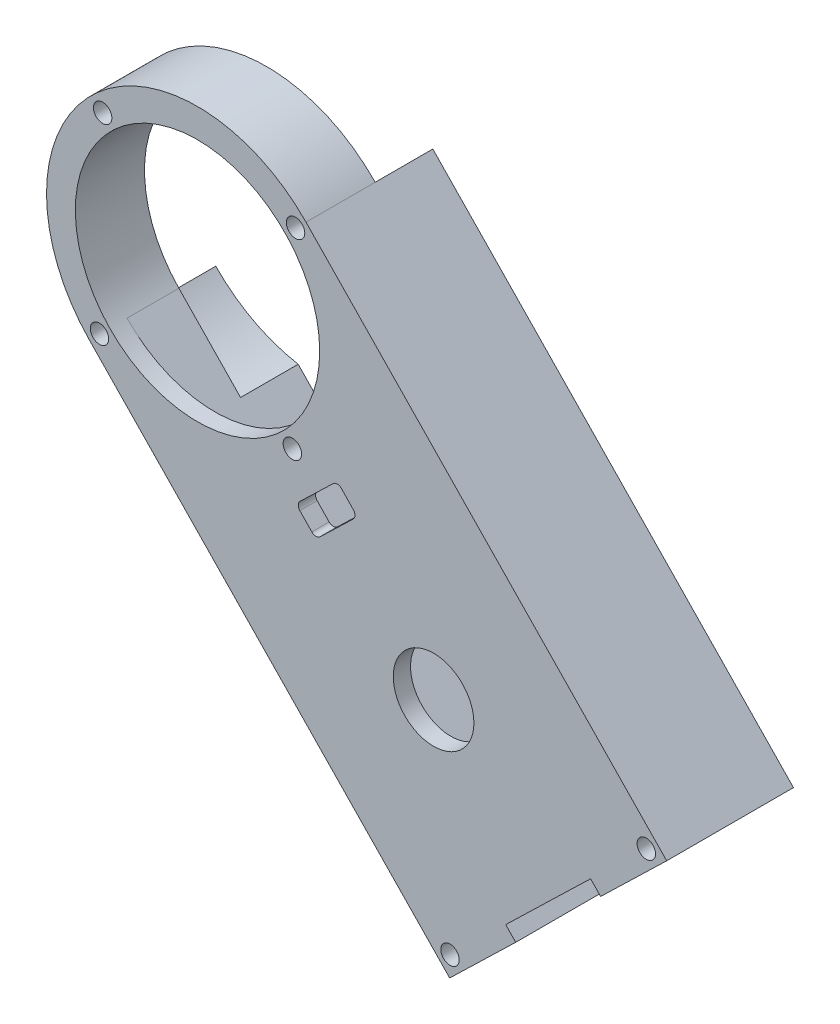
ISO-10303-21;
HEADER;
FILE_DESCRIPTION(('STEP AP214'),'2;1');
FILE_NAME('part.step','',(''),(''),'','','');
FILE_SCHEMA(('AUTOMOTIVE_DESIGN { 1 0 10303 214 1 1 1 1 }'));
ENDSEC;
DATA;
#1=APPLICATION_CONTEXT('core data for automotive mechanical design processes');
#2=APPLICATION_PROTOCOL_DEFINITION('international standard','automotive_design',2000,#1);
#3=PRODUCT_CONTEXT('',#1,'mechanical');
#4=PRODUCT('Part','Part','',(#3));
#5=PRODUCT_RELATED_PRODUCT_CATEGORY('part','',(#4));
#6=PRODUCT_DEFINITION_FORMATION('','',#4);
#7=PRODUCT_DEFINITION_CONTEXT('part definition',#1,'design');
#8=PRODUCT_DEFINITION('design','',#6,#7);
#9=PRODUCT_DEFINITION_SHAPE('','',#8);
#10=(LENGTH_UNIT() NAMED_UNIT(*) SI_UNIT(.MILLI.,.METRE.));
#11=(NAMED_UNIT(*) PLANE_ANGLE_UNIT() SI_UNIT($,.RADIAN.));
#12=(NAMED_UNIT(*) SI_UNIT($,.STERADIAN.) SOLID_ANGLE_UNIT());
#13=UNCERTAINTY_MEASURE_WITH_UNIT(LENGTH_MEASURE(1.E-05),#10,'distance_accuracy_value','');
#14=(GEOMETRIC_REPRESENTATION_CONTEXT(3) GLOBAL_UNCERTAINTY_ASSIGNED_CONTEXT((#13)) GLOBAL_UNIT_ASSIGNED_CONTEXT((#10,
#11,#12)) REPRESENTATION_CONTEXT('',''));
#15=CARTESIAN_POINT('',(0.,0.,0.));
#16=DIRECTION('',(0.,0.,1.));
#17=DIRECTION('',(1.,0.,0.));
#18=AXIS2_PLACEMENT_3D('',#15,#16,#17);
#19=CARTESIAN_POINT('',(43.8707482583933,-75.8274188354628,22.));
#20=DIRECTION('',(0.718654486573144,0.695367333808751,0.));
#21=DIRECTION('',(-0.695367333808751,0.718654486573144,0.));
#22=AXIS2_PLACEMENT_3D('',#19,#20,#21);
#23=PLANE('',#22);
#24=DIRECTION('',(0.,0.,-1.));
#25=VECTOR('',#24,1.);
#26=CARTESIAN_POINT('',(-15.2354751153505,-14.7417874767456,22.));
#27=LINE('',#26,#25);
#28=CARTESIAN_POINT('',(-15.2354751153505,-14.7417874767456,19.));
#29=VERTEX_POINT('',#28);
#30=CARTESIAN_POINT('',(-15.2354751153505,-14.7417874767456,10.));
#31=VERTEX_POINT('',#30);
#32=EDGE_CURVE('E53',#29,#31,#27,.T.);
#33=ORIENTED_EDGE('',*,*,#32,.F.);
#34=DIRECTION('',(0.695367333808751,-0.718654486573144,0.));
#35=VECTOR('',#34,1.);
#36=CARTESIAN_POINT('',(-15.2354751153505,-14.7417874767456,19.));
#37=LINE('',#36,#35);
#38=CARTESIAN_POINT('',(43.8707482583933,-75.8274188354628,19.));
#39=VERTEX_POINT('',#38);
#40=EDGE_CURVE('E57',#29,#39,#37,.T.);
#41=ORIENTED_EDGE('',*,*,#40,.T.);
#42=DIRECTION('',(0.,0.,-1.));
#43=VECTOR('',#42,1.);
#44=CARTESIAN_POINT('',(43.8707482583933,-75.8274188354628,22.));
#45=LINE('',#44,#43);
#46=CARTESIAN_POINT('',(43.8707482583933,-75.8274188354628,0.));
#47=VERTEX_POINT('',#46);
#48=EDGE_CURVE('E317',#39,#47,#45,.T.);
#49=ORIENTED_EDGE('',*,*,#48,.T.);
#50=DIRECTION('',(0.695367333808751,-0.718654486573144,0.));
#51=VECTOR('',#50,1.);
#52=CARTESIAN_POINT('',(43.8707482583933,-75.8274188354628,0.));
#53=LINE('',#52,#51);
#54=CARTESIAN_POINT('',(-4.53043108199875,-25.8053326700365,0.));
#55=VERTEX_POINT('',#54);
#56=EDGE_CURVE('E303',#55,#47,#53,.T.);
#57=ORIENTED_EDGE('',*,*,#56,.F.);
#58=DIRECTION('',(0.,0.,-1.));
#59=VECTOR('',#58,1.);
#60=CARTESIAN_POINT('',(-4.53043108199875,-25.8053326700365,10.));
#61=LINE('',#60,#59);
#62=CARTESIAN_POINT('',(-4.53043108199875,-25.8053326700365,10.));
#63=VERTEX_POINT('',#62);
#64=EDGE_CURVE('E296',#63,#55,#61,.T.);
#65=ORIENTED_EDGE('',*,*,#64,.F.);
#66=DIRECTION('',(-0.695367333808751,0.718654486573144,0.));
#67=VECTOR('',#66,1.);
#68=CARTESIAN_POINT('',(43.8707482583933,-75.8274188354628,10.));
#69=LINE('',#68,#67);
#70=EDGE_CURVE('E294',#63,#31,#69,.T.);
#71=ORIENTED_EDGE('',*,*,#70,.T.);
#72=EDGE_LOOP('',(#33,#41,#49,#57,#65,#71));
#73=FACE_BOUND('',#72,.T.);
#74=ADVANCED_FACE('F36',(#73),#23,.T.);
#75=CARTESIAN_POINT('',(74.3416984890946,-46.3438438819718,22.));
#76=DIRECTION('',(-0.695367333808751,0.718654486573144,0.));
#77=DIRECTION('',(-0.718654486573144,-0.695367333808751,0.));
#78=AXIS2_PLACEMENT_3D('',#75,#76,#77);
#79=PLANE('',#78);
#80=CARTESIAN_POINT('',(70.2453679156274,-50.3074376846819,11.5000000000073));
#81=DIRECTION('',(0.695367333808751,-0.718654486573144,0.));
#82=DIRECTION('',(0.718654486573144,0.695367333808751,0.));
#83=AXIS2_PLACEMENT_3D('',#80,#81,#82);
#84=CIRCLE('',#83,1.8);
#85=CARTESIAN_POINT('',(71.538945991459,-49.0557764838262,11.5000000000073));
#86=VERTEX_POINT('',#85);
#87=EDGE_CURVE('E241',#86,#86,#84,.T.);
#88=ORIENTED_EDGE('',*,*,#87,.T.);
#89=EDGE_LOOP('',(#88));
#90=FACE_BOUND('',#89,.T.);
#91=CARTESIAN_POINT('',(47.9670788318599,-71.8638250327532,11.5000000000027));
#92=DIRECTION('',(0.695367333808751,-0.718654486573144,0.));
#93=DIRECTION('',(0.718654486573144,0.695367333808751,0.));
#94=AXIS2_PLACEMENT_3D('',#91,#92,#93);
#95=CIRCLE('',#94,1.8);
#96=CARTESIAN_POINT('',(49.2606569076916,-70.6121638318975,11.5000000000027));
#97=VERTEX_POINT('',#96);
#98=EDGE_CURVE('E409',#97,#97,#95,.T.);
#99=ORIENTED_EDGE('',*,*,#98,.T.);
#100=EDGE_LOOP('',(#99));
#101=FACE_BOUND('',#100,.T.);
#102=ORIENTED_EDGE('',*,*,#48,.F.);
#103=DIRECTION('',(0.718654486573144,0.695367333808751,0.));
#104=VECTOR('',#103,1.);
#105=CARTESIAN_POINT('',(43.8707482583933,-75.8274188354628,19.));
#106=LINE('',#105,#104);
#107=CARTESIAN_POINT('',(74.3416984890946,-46.3438438819718,19.));
#108=VERTEX_POINT('',#107);
#109=EDGE_CURVE('E277',#39,#108,#106,.T.);
#110=ORIENTED_EDGE('',*,*,#109,.T.);
#111=DIRECTION('',(0.,0.,-1.));
#112=VECTOR('',#111,1.);
#113=CARTESIAN_POINT('',(74.3416984890946,-46.3438438819718,22.));
#114=LINE('',#113,#112);
#115=CARTESIAN_POINT('',(74.3416984890946,-46.3438438819718,0.));
#116=VERTEX_POINT('',#115);
#117=EDGE_CURVE('E307',#108,#116,#114,.T.);
#118=ORIENTED_EDGE('',*,*,#117,.T.);
#119=DIRECTION('',(0.718654486573144,0.695367333808751,0.));
#120=VECTOR('',#119,1.);
#121=CARTESIAN_POINT('',(74.3416984890946,-46.3438438819718,0.));
#122=LINE('',#121,#120);
#123=EDGE_CURVE('E311',#47,#116,#122,.T.);
#124=ORIENTED_EDGE('',*,*,#123,.F.);
#125=EDGE_LOOP('',(#102,#110,#118,#124));
#126=FACE_BOUND('',#125,.T.);
#127=ADVANCED_FACE('F473',(#90,#101,#126),#79,.T.);
#128=CARTESIAN_POINT('',(37.4687342562338,-8.23604115552882,22.));
#129=DIRECTION('',(-0.718654486573144,-0.695367333808751,0.));
#130=DIRECTION('',(0.695367333808751,-0.718654486573144,0.));
#131=AXIS2_PLACEMENT_3D('',#128,#129,#130);
#132=PLANE('',#131);
#133=ORIENTED_EDGE('',*,*,#117,.F.);
#134=DIRECTION('',(-0.695367333808751,0.718654486573144,0.));
#135=VECTOR('',#134,1.);
#136=CARTESIAN_POINT('',(74.3416984890946,-46.3438438819718,19.));
#137=LINE('',#136,#135);
#138=CARTESIAN_POINT('',(15.2354751153508,14.7417874767454,19.));
#139=VERTEX_POINT('',#138);
#140=EDGE_CURVE('E279',#108,#139,#137,.T.);
#141=ORIENTED_EDGE('',*,*,#140,.T.);
#142=DIRECTION('',(0.,0.,-1.));
#143=VECTOR('',#142,1.);
#144=CARTESIAN_POINT('',(15.2354751153508,14.7417874767454,22.));
#145=LINE('',#144,#143);
#146=CARTESIAN_POINT('',(15.2354751153508,14.7417874767454,10.));
#147=VERTEX_POINT('',#146);
#148=EDGE_CURVE('E320',#139,#147,#145,.T.);
#149=ORIENTED_EDGE('',*,*,#148,.T.);
#150=DIRECTION('',(0.695367333808751,-0.718654486573144,0.));
#151=VECTOR('',#150,1.);
#152=CARTESIAN_POINT('',(37.4687342562338,-8.23604115552882,10.));
#153=LINE('',#152,#151);
#154=CARTESIAN_POINT('',(25.9405191487024,3.67824228345468,10.));
#155=VERTEX_POINT('',#154);
#156=EDGE_CURVE('E45',#147,#155,#153,.T.);
#157=ORIENTED_EDGE('',*,*,#156,.T.);
#158=DIRECTION('',(0.,0.,-1.));
#159=VECTOR('',#158,1.);
#160=CARTESIAN_POINT('',(25.9405191487024,3.67824228345469,10.));
#161=LINE('',#160,#159);
#162=CARTESIAN_POINT('',(25.9405191487024,3.67824228345468,0.));
#163=VERTEX_POINT('',#162);
#164=EDGE_CURVE('E11',#163,#155,#161,.F.);
#165=ORIENTED_EDGE('',*,*,#164,.F.);
#166=DIRECTION('',(-0.695367333808751,0.718654486573144,0.));
#167=VECTOR('',#166,1.);
#168=CARTESIAN_POINT('',(37.4687342562338,-8.23604115552882,0.));
#169=LINE('',#168,#167);
#170=EDGE_CURVE('E308',#116,#163,#169,.T.);
#171=ORIENTED_EDGE('',*,*,#170,.F.);
#172=EDGE_LOOP('',(#133,#141,#149,#157,#165,#171));
#173=FACE_BOUND('',#172,.T.);
#174=ADVANCED_FACE('F478',(#173),#132,.T.);
#175=CARTESIAN_POINT('',(1.56957780106382E-13,-1.13520304267922E-13,22.));
#176=DIRECTION('',(0.,0.,-1.));
#177=DIRECTION('',(-1.,0.,0.));
#178=AXIS2_PLACEMENT_3D('',#175,#176,#177);
#179=CYLINDRICAL_SURFACE('',#178,26.2);
#180=CARTESIAN_POINT('',(0.,0.,10.));
#181=DIRECTION('',(0.,0.,-1.));
#182=DIRECTION('',(-1.,0.,0.));
#183=AXIS2_PLACEMENT_3D('',#180,#181,#182);
#184=CIRCLE('',#183,26.1999999999998);
#185=CARTESIAN_POINT('',(-18.8287475482163,-18.2186241457892,10.));
#186=VERTEX_POINT('',#185);
#187=CARTESIAN_POINT('',(18.8287475482164,18.218624145789,10.));
#188=VERTEX_POINT('',#187);
#189=EDGE_CURVE('E289',#186,#188,#184,.T.);
#190=ORIENTED_EDGE('',*,*,#189,.F.);
#191=DIRECTION('',(0.,0.,-1.));
#192=VECTOR('',#191,1.);
#193=CARTESIAN_POINT('',(-18.8287475482163,-18.2186241457893,22.));
#194=LINE('',#193,#192);
#195=CARTESIAN_POINT('',(-18.8287475482163,-18.2186241457893,22.));
#196=VERTEX_POINT('',#195);
#197=EDGE_CURVE('E370',#196,#186,#194,.T.);
#198=ORIENTED_EDGE('',*,*,#197,.F.);
#199=CARTESIAN_POINT('',(1.56957780106382E-13,-1.13520304267922E-13,22.));
#200=DIRECTION('',(0.,0.,1.));
#201=DIRECTION('',(1.,0.,0.));
#202=AXIS2_PLACEMENT_3D('',#199,#200,#201);
#203=CIRCLE('',#202,26.2);
#204=CARTESIAN_POINT('',(18.8287475482165,18.2186241457892,22.));
#205=VERTEX_POINT('',#204);
#206=EDGE_CURVE('E329',#205,#196,#203,.T.);
#207=ORIENTED_EDGE('',*,*,#206,.F.);
#208=DIRECTION('',(0.,0.,-1.));
#209=VECTOR('',#208,1.);
#210=CARTESIAN_POINT('',(18.8287475482165,18.2186241457892,22.));
#211=LINE('',#210,#209);
#212=EDGE_CURVE('E373',#205,#188,#211,.T.);
#213=ORIENTED_EDGE('',*,*,#212,.T.);
#214=EDGE_LOOP('',(#190,#198,#207,#213));
#215=FACE_BOUND('',#214,.T.);
#216=ADVANCED_FACE('F484',(#215),#179,.T.);
#217=CARTESIAN_POINT('',(1.56957780106382E-13,-1.13520304267922E-13,22.));
#218=DIRECTION('',(0.,0.,-1.));
#219=DIRECTION('',(-1.,0.,0.));
#220=AXIS2_PLACEMENT_3D('',#217,#218,#219);
#221=CYLINDRICAL_SURFACE('',#220,21.2);
#222=CARTESIAN_POINT('',(0.,0.,19.));
#223=DIRECTION('',(0.,0.,-1.));
#224=DIRECTION('',(1.,0.,0.));
#225=AXIS2_PLACEMENT_3D('',#222,#223,#224);
#226=CIRCLE('',#225,21.2);
#227=EDGE_CURVE('E281',#139,#29,#226,.T.);
#228=ORIENTED_EDGE('',*,*,#227,.T.);
#229=ORIENTED_EDGE('',*,*,#32,.T.);
#230=CARTESIAN_POINT('',(1.56957780106382E-13,-1.13520304267922E-13,10.));
#231=DIRECTION('',(0.,0.,-1.));
#232=DIRECTION('',(-1.,0.,0.));
#233=AXIS2_PLACEMENT_3D('',#230,#231,#232);
#234=CIRCLE('',#233,21.2);
#235=EDGE_CURVE('E287',#31,#147,#234,.T.);
#236=ORIENTED_EDGE('',*,*,#235,.T.);
#237=ORIENTED_EDGE('',*,*,#148,.F.);
#238=EDGE_LOOP('',(#228,#229,#236,#237));
#239=FACE_BOUND('',#238,.T.);
#240=CARTESIAN_POINT('',(1.56957780106382E-13,-1.13520304267922E-13,22.));
#241=DIRECTION('',(0.,0.,1.));
#242=DIRECTION('',(1.,0.,0.));
#243=AXIS2_PLACEMENT_3D('',#240,#241,#242);
#244=CIRCLE('',#243,21.2);
#245=CARTESIAN_POINT('',(21.2000000000001,-1.13520304267922E-13,22.));
#246=VERTEX_POINT('',#245);
#247=EDGE_CURVE('E304',#246,#246,#244,.T.);
#248=ORIENTED_EDGE('',*,*,#247,.T.);
#249=EDGE_LOOP('',(#248));
#250=FACE_BOUND('',#249,.T.);
#251=ADVANCED_FACE('F441',(#239,#250),#221,.F.);
#252=CARTESIAN_POINT('',(1.56957780106382E-13,-1.13520304267922E-13,22.));
#253=DIRECTION('',(0.,0.,1.));
#254=DIRECTION('',(1.,0.,0.));
#255=AXIS2_PLACEMENT_3D('',#252,#253,#254);
#256=PLANE('',#255);
#257=CARTESIAN_POINT('',(-17.0123602989575,-16.4610947874136,22.));
#258=DIRECTION('',(0.,0.,1.));
#259=DIRECTION('',(1.,0.,0.));
#260=AXIS2_PLACEMENT_3D('',#257,#258,#259);
#261=CIRCLE('',#260,1.60000000000052);
#262=CARTESIAN_POINT('',(-15.412360298957,-16.4610947874136,22.));
#263=VERTEX_POINT('',#262);
#264=EDGE_CURVE('E426',#263,#263,#261,.T.);
#265=ORIENTED_EDGE('',*,*,#264,.F.);
#266=EDGE_LOOP('',(#265));
#267=FACE_BOUND('',#266,.T.);
#268=CARTESIAN_POINT('',(16.4610947874145,-17.0123602989575,22.));
#269=DIRECTION('',(0.,0.,1.));
#270=DIRECTION('',(1.,0.,0.));
#271=AXIS2_PLACEMENT_3D('',#268,#269,#270);
#272=CIRCLE('',#271,1.60000000000135);
#273=CARTESIAN_POINT('',(18.0610947874159,-17.0123602989575,22.));
#274=VERTEX_POINT('',#273);
#275=EDGE_CURVE('E429',#274,#274,#272,.T.);
#276=ORIENTED_EDGE('',*,*,#275,.F.);
#277=EDGE_LOOP('',(#276));
#278=FACE_BOUND('',#277,.T.);
#279=CARTESIAN_POINT('',(17.0123602989585,16.4610947874145,22.));
#280=DIRECTION('',(0.,0.,1.));
#281=DIRECTION('',(1.,0.,0.));
#282=AXIS2_PLACEMENT_3D('',#279,#280,#281);
#283=CIRCLE('',#282,1.60000000000098);
#284=CARTESIAN_POINT('',(18.6123602989595,16.4610947874145,22.));
#285=VERTEX_POINT('',#284);
#286=EDGE_CURVE('E425',#285,#285,#283,.T.);
#287=ORIENTED_EDGE('',*,*,#286,.F.);
#288=EDGE_LOOP('',(#287));
#289=FACE_BOUND('',#288,.T.);
#290=CARTESIAN_POINT('',(-16.4610947874136,17.0123602989585,22.));
#291=DIRECTION('',(0.,0.,1.));
#292=DIRECTION('',(1.,0.,0.));
#293=AXIS2_PLACEMENT_3D('',#290,#291,#292);
#294=CIRCLE('',#293,1.6);
#295=CARTESIAN_POINT('',(-14.8610947874136,17.0123602989585,22.));
#296=VERTEX_POINT('',#295);
#297=EDGE_CURVE('E385',#296,#296,#294,.T.);
#298=ORIENTED_EDGE('',*,*,#297,.F.);
#299=EDGE_LOOP('',(#298));
#300=FACE_BOUND('',#299,.T.);
#301=CARTESIAN_POINT('',(77.8767530400493,-46.4020617638827,22.));
#302=DIRECTION('',(0.,0.,1.));
#303=DIRECTION('',(1.,0.,0.));
#304=AXIS2_PLACEMENT_3D('',#301,#302,#303);
#305=CIRCLE('',#304,1.60000000000001);
#306=CARTESIAN_POINT('',(79.4767530400493,-46.4020617638827,22.));
#307=VERTEX_POINT('',#306);
#308=EDGE_CURVE('E401',#307,#307,#305,.T.);
#309=ORIENTED_EDGE('',*,*,#308,.F.);
#310=EDGE_LOOP('',(#309));
#311=FACE_BOUND('',#310,.T.);
#312=CARTESIAN_POINT('',(43.8125303764823,-79.3624733864175,22.));
#313=DIRECTION('',(0.,0.,1.));
#314=DIRECTION('',(1.,0.,0.));
#315=AXIS2_PLACEMENT_3D('',#312,#313,#314);
#316=CIRCLE('',#315,1.6);
#317=CARTESIAN_POINT('',(45.4125303764823,-79.3624733864175,22.));
#318=VERTEX_POINT('',#317);
#319=EDGE_CURVE('E392',#318,#318,#316,.T.);
#320=ORIENTED_EDGE('',*,*,#319,.F.);
#321=EDGE_LOOP('',(#320));
#322=FACE_BOUND('',#321,.T.);
#323=DIRECTION('',(0.718654486573144,0.695367333808751,0.));
#324=VECTOR('',#323,1.);
#325=CARTESIAN_POINT('',(69.9492685301624,-57.5513886200433,22.));
#326=LINE('',#325,#324);
#327=CARTESIAN_POINT('',(69.9492685301624,-57.5513886200433,22.));
#328=VERTEX_POINT('',#327);
#329=CARTESIAN_POINT('',(81.411807591004,-46.4602796457937,22.));
#330=VERTEX_POINT('',#329);
#331=EDGE_CURVE('E323',#328,#330,#326,.T.);
#332=ORIENTED_EDGE('',*,*,#331,.T.);
#333=DIRECTION('',(-0.695367333808751,0.718654486573144,0.));
#334=VECTOR('',#333,1.);
#335=CARTESIAN_POINT('',(81.411807591004,-46.4602796457937,22.));
#336=LINE('',#335,#334);
#337=EDGE_CURVE('E326',#330,#205,#336,.T.);
#338=ORIENTED_EDGE('',*,*,#337,.T.);
#339=ORIENTED_EDGE('',*,*,#206,.T.);
#340=DIRECTION('',(0.695367333808751,-0.718654486573144,0.));
#341=VECTOR('',#340,1.);
#342=CARTESIAN_POINT('',(-18.8287475482163,-18.2186241457893,22.));
#343=LINE('',#342,#341);
#344=CARTESIAN_POINT('',(43.7543124945713,-82.8975279373723,22.));
#345=VERTEX_POINT('',#344);
#346=EDGE_CURVE('E331',#196,#345,#343,.T.);
#347=ORIENTED_EDGE('',*,*,#346,.T.);
#348=DIRECTION('',(0.718654486573144,0.695367333808751,0.));
#349=VECTOR('',#348,1.);
#350=CARTESIAN_POINT('',(43.7543124945713,-82.8975279373723,22.));
#351=LINE('',#350,#349);
#352=CARTESIAN_POINT('',(55.2168515554129,-71.8064189631227,22.));
#353=VERTEX_POINT('',#352);
#354=EDGE_CURVE('E333',#345,#353,#351,.T.);
#355=ORIENTED_EDGE('',*,*,#354,.T.);
#356=DIRECTION('',(-0.69536733380875,0.718654486573145,0.));
#357=VECTOR('',#356,1.);
#358=CARTESIAN_POINT('',(55.2168515554129,-71.8064189631227,22.));
#359=LINE('',#358,#357);
#360=CARTESIAN_POINT('',(53.4784332208911,-70.0097827466898,22.));
#361=VERTEX_POINT('',#360);
#362=EDGE_CURVE('E335',#353,#361,#359,.T.);
#363=ORIENTED_EDGE('',*,*,#362,.T.);
#364=DIRECTION('',(0.718654486573144,0.695367333808751,0.));
#365=VECTOR('',#364,1.);
#366=CARTESIAN_POINT('',(53.4784332208911,-70.0097827466898,22.));
#367=LINE('',#366,#365);
#368=CARTESIAN_POINT('',(68.2108501956405,-55.7547524036104,22.));
#369=VERTEX_POINT('',#368);
#370=EDGE_CURVE('E337',#361,#369,#367,.T.);
#371=ORIENTED_EDGE('',*,*,#370,.T.);
#372=DIRECTION('',(0.69536733380875,-0.718654486573145,0.));
#373=VECTOR('',#372,1.);
#374=CARTESIAN_POINT('',(68.2108501956405,-55.7547524036104,22.));
#375=LINE('',#374,#373);
#376=EDGE_CURVE('E339',#369,#328,#375,.T.);
#377=ORIENTED_EDGE('',*,*,#376,.T.);
#378=EDGE_LOOP('',(#332,#338,#339,#347,#355,#363,#371,#377));
#379=FACE_BOUND('',#378,.T.);
#380=ORIENTED_EDGE('',*,*,#247,.F.);
#381=EDGE_LOOP('',(#380));
#382=FACE_BOUND('',#381,.T.);
#383=CARTESIAN_POINT('',(18.4812604364384,-24.9678504211436,22.));
#384=DIRECTION('',(0.,0.,1.));
#385=DIRECTION('',(1.,0.,0.));
#386=AXIS2_PLACEMENT_3D('',#383,#384,#385);
#387=CIRCLE('',#386,1.);
#388=CARTESIAN_POINT('',(17.7877664641137,-24.247387993012,22.));
#389=VERTEX_POINT('',#388);
#390=CARTESIAN_POINT('',(17.7607980083068,-25.6613443934683,22.));
#391=VERTEX_POINT('',#390);
#392=EDGE_CURVE('E198',#389,#391,#387,.T.);
#393=ORIENTED_EDGE('',*,*,#392,.F.);
#394=DIRECTION('',(-0.720462428131584,-0.693493972324736,0.));
#395=VECTOR('',#394,1.);
#396=CARTESIAN_POINT('',(23.5514658891663,-18.6994362144141,22.));
#397=LINE('',#396,#395);
#398=CARTESIAN_POINT('',(23.5514658891663,-18.6994362144141,22.));
#399=VERTEX_POINT('',#398);
#400=EDGE_CURVE('E217',#399,#389,#397,.T.);
#401=ORIENTED_EDGE('',*,*,#400,.F.);
#402=CARTESIAN_POINT('',(24.2449598614911,-19.4198986425457,22.));
#403=DIRECTION('',(0.,0.,1.));
#404=DIRECTION('',(1.,0.,0.));
#405=AXIS2_PLACEMENT_3D('',#402,#403,#404);
#406=CIRCLE('',#405,0.999999999999999);
#407=CARTESIAN_POINT('',(24.9654222896227,-18.726404670221,22.));
#408=VERTEX_POINT('',#407);
#409=EDGE_CURVE('E220',#408,#399,#406,.T.);
#410=ORIENTED_EDGE('',*,*,#409,.F.);
#411=DIRECTION('',(-0.693493972324736,0.720462428131584,0.));
#412=VECTOR('',#411,1.);
#413=CARTESIAN_POINT('',(24.9654222896227,-18.726404670221,22.));
#414=LINE('',#413,#412);
#415=CARTESIAN_POINT('',(27.0459042065969,-20.8877919546157,22.));
#416=VERTEX_POINT('',#415);
#417=EDGE_CURVE('E252',#416,#408,#414,.T.);
#418=ORIENTED_EDGE('',*,*,#417,.F.);
#419=CARTESIAN_POINT('',(26.3254417784653,-21.5812859269405,22.));
#420=DIRECTION('',(0.,0.,1.));
#421=DIRECTION('',(1.,0.,0.));
#422=AXIS2_PLACEMENT_3D('',#419,#420,#421);
#423=CIRCLE('',#422,1.);
#424=CARTESIAN_POINT('',(27.01893575079,-22.301748355072,22.));
#425=VERTEX_POINT('',#424);
#426=EDGE_CURVE('E249',#425,#416,#423,.T.);
#427=ORIENTED_EDGE('',*,*,#426,.F.);
#428=DIRECTION('',(0.720462428131584,0.693493972324736,0.));
#429=VECTOR('',#428,1.);
#430=CARTESIAN_POINT('',(27.01893575079,-22.301748355072,22.));
#431=LINE('',#430,#429);
#432=CARTESIAN_POINT('',(21.2552363257374,-27.8497001336699,22.));
#433=VERTEX_POINT('',#432);
#434=EDGE_CURVE('E246',#433,#425,#431,.T.);
#435=ORIENTED_EDGE('',*,*,#434,.F.);
#436=CARTESIAN_POINT('',(20.5617423534126,-27.1292377055383,22.));
#437=DIRECTION('',(0.,0.,1.));
#438=DIRECTION('',(1.,0.,0.));
#439=AXIS2_PLACEMENT_3D('',#436,#437,#438);
#440=CIRCLE('',#439,1.);
#441=CARTESIAN_POINT('',(19.841279925281,-27.8227316778631,22.));
#442=VERTEX_POINT('',#441);
#443=EDGE_CURVE('E243',#442,#433,#440,.T.);
#444=ORIENTED_EDGE('',*,*,#443,.F.);
#445=DIRECTION('',(0.693493972324737,-0.720462428131584,0.));
#446=VECTOR('',#445,1.);
#447=CARTESIAN_POINT('',(17.7607980083068,-25.6613443934683,22.));
#448=LINE('',#447,#446);
#449=EDGE_CURVE('E240',#391,#442,#448,.T.);
#450=ORIENTED_EDGE('',*,*,#449,.F.);
#451=EDGE_LOOP('',(#393,#401,#410,#418,#427,#435,#444,#450));
#452=FACE_BOUND('',#451,.T.);
#453=CARTESIAN_POINT('',(40.9617272164555,-42.4773031544428,22.));
#454=DIRECTION('',(0.,0.,1.));
#455=DIRECTION('',(1.,0.,0.));
#456=AXIS2_PLACEMENT_3D('',#453,#454,#455);
#457=CIRCLE('',#456,7.);
#458=CARTESIAN_POINT('',(47.9617272164555,-42.4773031544428,22.));
#459=VERTEX_POINT('',#458);
#460=EDGE_CURVE('E259',#459,#459,#457,.T.);
#461=ORIENTED_EDGE('',*,*,#460,.F.);
#462=EDGE_LOOP('',(#461));
#463=FACE_BOUND('',#462,.T.);
#464=ADVANCED_FACE('F437',(#267,#278,#289,#300,#311,#322,#379,#382,#452,#463),#256,.T.);
#465=CARTESIAN_POINT('',(1.56957780106382E-13,-1.13520304267922E-13,0.));
#466=DIRECTION('',(0.,0.,1.));
#467=DIRECTION('',(1.,0.,0.));
#468=AXIS2_PLACEMENT_3D('',#465,#466,#467);
#469=PLANE('',#468);
#470=CARTESIAN_POINT('',(77.8767530400493,-46.4020617638827,0.));
#471=DIRECTION('',(0.,0.,1.));
#472=DIRECTION('',(1.,0.,0.));
#473=AXIS2_PLACEMENT_3D('',#470,#471,#472);
#474=CIRCLE('',#473,1.60000000000001);
#475=CARTESIAN_POINT('',(79.4767530400493,-46.4020617638827,0.));
#476=VERTEX_POINT('',#475);
#477=EDGE_CURVE('E414',#476,#476,#474,.T.);
#478=ORIENTED_EDGE('',*,*,#477,.T.);
#479=EDGE_LOOP('',(#478));
#480=FACE_BOUND('',#479,.T.);
#481=CARTESIAN_POINT('',(43.8125303764823,-79.3624733864175,0.));
#482=DIRECTION('',(0.,0.,1.));
#483=DIRECTION('',(1.,0.,0.));
#484=AXIS2_PLACEMENT_3D('',#481,#482,#483);
#485=CIRCLE('',#484,1.6);
#486=CARTESIAN_POINT('',(45.4125303764823,-79.3624733864175,0.));
#487=VERTEX_POINT('',#486);
#488=EDGE_CURVE('E396',#487,#487,#485,.T.);
#489=ORIENTED_EDGE('',*,*,#488,.T.);
#490=EDGE_LOOP('',(#489));
#491=FACE_BOUND('',#490,.T.);
#492=ORIENTED_EDGE('',*,*,#170,.T.);
#493=CARTESIAN_POINT('',(0.,0.,0.));
#494=DIRECTION('',(0.,0.,-1.));
#495=DIRECTION('',(-1.,0.,0.));
#496=AXIS2_PLACEMENT_3D('',#493,#494,#495);
#497=CIRCLE('',#496,26.1999999999998);
#498=CARTESIAN_POINT('',(18.8287475482164,18.218624145789,0.));
#499=VERTEX_POINT('',#498);
#500=EDGE_CURVE('E290',#499,#163,#497,.T.);
#501=ORIENTED_EDGE('',*,*,#500,.F.);
#502=DIRECTION('',(-0.695367333808751,0.718654486573144,0.));
#503=VECTOR('',#502,1.);
#504=CARTESIAN_POINT('',(81.411807591004,-46.4602796457937,0.));
#505=LINE('',#504,#503);
#506=CARTESIAN_POINT('',(81.411807591004,-46.4602796457937,0.));
#507=VERTEX_POINT('',#506);
#508=EDGE_CURVE('E344',#507,#499,#505,.T.);
#509=ORIENTED_EDGE('',*,*,#508,.F.);
#510=DIRECTION('',(0.718654486573144,0.695367333808751,0.));
#511=VECTOR('',#510,1.);
#512=CARTESIAN_POINT('',(69.9492685301624,-57.5513886200433,0.));
#513=LINE('',#512,#511);
#514=CARTESIAN_POINT('',(69.9492685301624,-57.5513886200433,0.));
#515=VERTEX_POINT('',#514);
#516=EDGE_CURVE('E322',#515,#507,#513,.T.);
#517=ORIENTED_EDGE('',*,*,#516,.F.);
#518=DIRECTION('',(0.69536733380875,-0.718654486573145,0.));
#519=VECTOR('',#518,1.);
#520=CARTESIAN_POINT('',(68.2108501956405,-55.7547524036104,0.));
#521=LINE('',#520,#519);
#522=CARTESIAN_POINT('',(68.2108501956405,-55.7547524036104,0.));
#523=VERTEX_POINT('',#522);
#524=EDGE_CURVE('E327',#523,#515,#521,.T.);
#525=ORIENTED_EDGE('',*,*,#524,.F.);
#526=DIRECTION('',(0.718654486573144,0.695367333808751,0.));
#527=VECTOR('',#526,1.);
#528=CARTESIAN_POINT('',(53.4784332208911,-70.0097827466898,0.));
#529=LINE('',#528,#527);
#530=CARTESIAN_POINT('',(53.4784332208911,-70.0097827466898,0.));
#531=VERTEX_POINT('',#530);
#532=EDGE_CURVE('E353',#531,#523,#529,.T.);
#533=ORIENTED_EDGE('',*,*,#532,.F.);
#534=DIRECTION('',(-0.69536733380875,0.718654486573145,0.));
#535=VECTOR('',#534,1.);
#536=CARTESIAN_POINT('',(55.2168515554129,-71.8064189631227,0.));
#537=LINE('',#536,#535);
#538=CARTESIAN_POINT('',(55.2168515554129,-71.8064189631227,0.));
#539=VERTEX_POINT('',#538);
#540=EDGE_CURVE('E351',#539,#531,#537,.T.);
#541=ORIENTED_EDGE('',*,*,#540,.F.);
#542=DIRECTION('',(0.718654486573144,0.695367333808751,0.));
#543=VECTOR('',#542,1.);
#544=CARTESIAN_POINT('',(43.7543124945713,-82.8975279373723,0.));
#545=LINE('',#544,#543);
#546=CARTESIAN_POINT('',(43.7543124945713,-82.8975279373723,0.));
#547=VERTEX_POINT('',#546);
#548=EDGE_CURVE('E349',#547,#539,#545,.T.);
#549=ORIENTED_EDGE('',*,*,#548,.F.);
#550=DIRECTION('',(0.695367333808751,-0.718654486573144,0.));
#551=VECTOR('',#550,1.);
#552=CARTESIAN_POINT('',(-18.8287475482163,-18.2186241457893,0.));
#553=LINE('',#552,#551);
#554=CARTESIAN_POINT('',(-18.8287475482163,-18.2186241457892,0.));
#555=VERTEX_POINT('',#554);
#556=EDGE_CURVE('E347',#555,#547,#553,.T.);
#557=ORIENTED_EDGE('',*,*,#556,.F.);
#558=EDGE_CURVE('E284',#55,#555,#497,.T.);
#559=ORIENTED_EDGE('',*,*,#558,.F.);
#560=ORIENTED_EDGE('',*,*,#56,.T.);
#561=ORIENTED_EDGE('',*,*,#123,.T.);
#562=EDGE_LOOP('',(#492,#501,#509,#517,#525,#533,#541,#549,#557,#559,#560,#561));
#563=FACE_BOUND('',#562,.T.);
#564=ADVANCED_FACE('F440',(#480,#491,#563),#469,.F.);
#565=CARTESIAN_POINT('',(69.9492685301624,-57.5513886200433,22.));
#566=DIRECTION('',(-0.695367333808751,0.718654486573144,0.));
#567=DIRECTION('',(-0.718654486573144,-0.695367333808751,0.));
#568=AXIS2_PLACEMENT_3D('',#565,#566,#567);
#569=PLANE('',#568);
#570=CARTESIAN_POINT('',(73.7222045846711,-53.9007101175477,11.5000000000073));
#571=DIRECTION('',(0.695367333808751,-0.718654486573144,0.));
#572=DIRECTION('',(0.718654486573144,0.695367333808751,0.));
#573=AXIS2_PLACEMENT_3D('',#570,#571,#572);
#574=CIRCLE('',#573,1.8);
#575=CARTESIAN_POINT('',(75.0157826605028,-52.6490489166919,11.5000000000073));
#576=VERTEX_POINT('',#575);
#577=EDGE_CURVE('E407',#576,#576,#574,.T.);
#578=ORIENTED_EDGE('',*,*,#577,.F.);
#579=EDGE_LOOP('',(#578));
#580=FACE_BOUND('',#579,.T.);
#581=ORIENTED_EDGE('',*,*,#516,.T.);
#582=DIRECTION('',(0.,0.,-1.));
#583=VECTOR('',#582,1.);
#584=CARTESIAN_POINT('',(81.411807591004,-46.4602796457937,22.));
#585=LINE('',#584,#583);
#586=EDGE_CURVE('E376',#330,#507,#585,.T.);
#587=ORIENTED_EDGE('',*,*,#586,.F.);
#588=ORIENTED_EDGE('',*,*,#331,.F.);
#589=DIRECTION('',(0.,0.,-1.));
#590=VECTOR('',#589,1.);
#591=CARTESIAN_POINT('',(69.9492685301624,-57.5513886200433,22.));
#592=LINE('',#591,#590);
#593=EDGE_CURVE('E341',#328,#515,#592,.T.);
#594=ORIENTED_EDGE('',*,*,#593,.T.);
#595=EDGE_LOOP('',(#581,#587,#588,#594));
#596=FACE_BOUND('',#595,.T.);
#597=ADVANCED_FACE('F38',(#580,#596),#569,.F.);
#598=CARTESIAN_POINT('',(81.411807591004,-46.4602796457937,22.));
#599=DIRECTION('',(-0.718654486573144,-0.695367333808751,0.));
#600=DIRECTION('',(0.695367333808751,-0.718654486573144,0.));
#601=AXIS2_PLACEMENT_3D('',#598,#599,#600);
#602=PLANE('',#601);
#603=ORIENTED_EDGE('',*,*,#508,.T.);
#604=DIRECTION('',(0.,0.,-1.));
#605=VECTOR('',#604,1.);
#606=CARTESIAN_POINT('',(18.8287475482163,18.2186241457892,10.));
#607=LINE('',#606,#605);
#608=EDGE_CURVE('E301',#188,#499,#607,.T.);
#609=ORIENTED_EDGE('',*,*,#608,.F.);
#610=ORIENTED_EDGE('',*,*,#212,.F.);
#611=ORIENTED_EDGE('',*,*,#337,.F.);
#612=ORIENTED_EDGE('',*,*,#586,.T.);
#613=EDGE_LOOP('',(#603,#609,#610,#611,#612));
#614=FACE_BOUND('',#613,.T.);
#615=ADVANCED_FACE('F509',(#614),#602,.F.);
#616=CARTESIAN_POINT('',(-18.8287475482163,-18.2186241457893,22.));
#617=DIRECTION('',(0.718654486573144,0.695367333808751,0.));
#618=DIRECTION('',(-0.695367333808751,0.718654486573144,0.));
#619=AXIS2_PLACEMENT_3D('',#616,#617,#618);
#620=PLANE('',#619);
#621=ORIENTED_EDGE('',*,*,#556,.T.);
#622=DIRECTION('',(0.,0.,-1.));
#623=VECTOR('',#622,1.);
#624=CARTESIAN_POINT('',(43.7543124945713,-82.8975279373723,22.));
#625=LINE('',#624,#623);
#626=EDGE_CURVE('E367',#345,#547,#625,.T.);
#627=ORIENTED_EDGE('',*,*,#626,.F.);
#628=ORIENTED_EDGE('',*,*,#346,.F.);
#629=ORIENTED_EDGE('',*,*,#197,.T.);
#630=DIRECTION('',(0.,0.,-1.));
#631=VECTOR('',#630,1.);
#632=CARTESIAN_POINT('',(-18.8287475482163,-18.2186241457892,10.));
#633=LINE('',#632,#631);
#634=EDGE_CURVE('E298',#186,#555,#633,.T.);
#635=ORIENTED_EDGE('',*,*,#634,.T.);
#636=EDGE_LOOP('',(#621,#627,#628,#629,#635));
#637=FACE_BOUND('',#636,.T.);
#638=ADVANCED_FACE('F505',(#637),#620,.F.);
#639=CARTESIAN_POINT('',(43.7543124945713,-82.8975279373723,22.));
#640=DIRECTION('',(-0.695367333808751,0.718654486573144,0.));
#641=DIRECTION('',(-0.718654486573144,-0.695367333808751,0.));
#642=AXIS2_PLACEMENT_3D('',#639,#640,#641);
#643=PLANE('',#642);
#644=CARTESIAN_POINT('',(51.4439155009037,-75.4570974656189,11.5000000000027));
#645=DIRECTION('',(0.695367333808751,-0.718654486573144,0.));
#646=DIRECTION('',(0.718654486573144,0.695367333808751,0.));
#647=AXIS2_PLACEMENT_3D('',#644,#645,#646);
#648=CIRCLE('',#647,1.8);
#649=CARTESIAN_POINT('',(52.7374935767353,-74.2054362647632,11.5000000000027));
#650=VERTEX_POINT('',#649);
#651=EDGE_CURVE('E223',#650,#650,#648,.T.);
#652=ORIENTED_EDGE('',*,*,#651,.F.);
#653=EDGE_LOOP('',(#652));
#654=FACE_BOUND('',#653,.T.);
#655=ORIENTED_EDGE('',*,*,#548,.T.);
#656=DIRECTION('',(0.,0.,-1.));
#657=VECTOR('',#656,1.);
#658=CARTESIAN_POINT('',(55.2168515554129,-71.8064189631227,22.));
#659=LINE('',#658,#657);
#660=EDGE_CURVE('E364',#353,#539,#659,.T.);
#661=ORIENTED_EDGE('',*,*,#660,.F.);
#662=ORIENTED_EDGE('',*,*,#354,.F.);
#663=ORIENTED_EDGE('',*,*,#626,.T.);
#664=EDGE_LOOP('',(#655,#661,#662,#663));
#665=FACE_BOUND('',#664,.T.);
#666=ADVANCED_FACE('F501',(#654,#665),#643,.F.);
#667=CARTESIAN_POINT('',(55.2168515554129,-71.8064189631227,22.));
#668=DIRECTION('',(-0.718654486573145,-0.69536733380875,0.));
#669=DIRECTION('',(0.69536733380875,-0.718654486573145,0.));
#670=AXIS2_PLACEMENT_3D('',#667,#668,#669);
#671=PLANE('',#670);
#672=ORIENTED_EDGE('',*,*,#540,.T.);
#673=DIRECTION('',(0.,0.,-1.));
#674=VECTOR('',#673,1.);
#675=CARTESIAN_POINT('',(53.4784332208911,-70.0097827466898,22.));
#676=LINE('',#675,#674);
#677=EDGE_CURVE('E361',#361,#531,#676,.T.);
#678=ORIENTED_EDGE('',*,*,#677,.F.);
#679=ORIENTED_EDGE('',*,*,#362,.F.);
#680=ORIENTED_EDGE('',*,*,#660,.T.);
#681=EDGE_LOOP('',(#672,#678,#679,#680));
#682=FACE_BOUND('',#681,.T.);
#683=ADVANCED_FACE('F497',(#682),#671,.F.);
#684=CARTESIAN_POINT('',(53.4784332208911,-70.0097827466898,22.));
#685=DIRECTION('',(-0.695367333808751,0.718654486573144,0.));
#686=DIRECTION('',(-0.718654486573144,-0.695367333808751,0.));
#687=AXIS2_PLACEMENT_3D('',#684,#685,#686);
#688=PLANE('',#687);
#689=ORIENTED_EDGE('',*,*,#532,.T.);
#690=DIRECTION('',(0.,0.,-1.));
#691=VECTOR('',#690,1.);
#692=CARTESIAN_POINT('',(68.2108501956405,-55.7547524036104,22.));
#693=LINE('',#692,#691);
#694=EDGE_CURVE('E358',#369,#523,#693,.T.);
#695=ORIENTED_EDGE('',*,*,#694,.F.);
#696=ORIENTED_EDGE('',*,*,#370,.F.);
#697=ORIENTED_EDGE('',*,*,#677,.T.);
#698=EDGE_LOOP('',(#689,#695,#696,#697));
#699=FACE_BOUND('',#698,.T.);
#700=ADVANCED_FACE('F493',(#699),#688,.F.);
#701=CARTESIAN_POINT('',(68.2108501956405,-55.7547524036104,22.));
#702=DIRECTION('',(0.718654486573145,0.69536733380875,0.));
#703=DIRECTION('',(-0.69536733380875,0.718654486573145,0.));
#704=AXIS2_PLACEMENT_3D('',#701,#702,#703);
#705=PLANE('',#704);
#706=ORIENTED_EDGE('',*,*,#524,.T.);
#707=ORIENTED_EDGE('',*,*,#593,.F.);
#708=ORIENTED_EDGE('',*,*,#376,.F.);
#709=ORIENTED_EDGE('',*,*,#694,.T.);
#710=EDGE_LOOP('',(#706,#707,#708,#709));
#711=FACE_BOUND('',#710,.T.);
#712=ADVANCED_FACE('F489',(#711),#705,.F.);
#713=CARTESIAN_POINT('',(0.,0.,10.));
#714=DIRECTION('',(0.,0.,-1.));
#715=DIRECTION('',(-1.,0.,0.));
#716=AXIS2_PLACEMENT_3D('',#713,#714,#715);
#717=CYLINDRICAL_SURFACE('',#716,26.1999999999998);
#718=EDGE_CURVE('E288',#63,#186,#184,.T.);
#719=ORIENTED_EDGE('',*,*,#718,.F.);
#720=ORIENTED_EDGE('',*,*,#64,.T.);
#721=ORIENTED_EDGE('',*,*,#558,.T.);
#722=ORIENTED_EDGE('',*,*,#634,.F.);
#723=EDGE_LOOP('',(#719,#720,#721,#722));
#724=FACE_BOUND('',#723,.T.);
#725=ADVANCED_FACE('F492',(#724),#717,.F.);
#726=ORIENTED_EDGE('',*,*,#608,.T.);
#727=ORIENTED_EDGE('',*,*,#500,.T.);
#728=ORIENTED_EDGE('',*,*,#164,.T.);
#729=EDGE_CURVE('E285',#188,#155,#184,.T.);
#730=ORIENTED_EDGE('',*,*,#729,.F.);
#731=EDGE_LOOP('',(#726,#727,#728,#730));
#732=FACE_BOUND('',#731,.T.);
#733=ADVANCED_FACE('F528',(#732),#717,.F.);
#734=CARTESIAN_POINT('',(0.,0.,10.));
#735=DIRECTION('',(0.,0.,-1.));
#736=DIRECTION('',(-1.,0.,0.));
#737=AXIS2_PLACEMENT_3D('',#734,#735,#736);
#738=PLANE('',#737);
#739=CARTESIAN_POINT('',(-17.0123602989575,-16.4610947874136,10.));
#740=DIRECTION('',(0.,0.,-1.));
#741=DIRECTION('',(-1.,0.,0.));
#742=AXIS2_PLACEMENT_3D('',#739,#740,#741);
#743=CIRCLE('',#742,1.60000000000052);
#744=CARTESIAN_POINT('',(-18.612360298958,-16.4610947874136,10.));
#745=VERTEX_POINT('',#744);
#746=EDGE_CURVE('E40',#745,#745,#743,.T.);
#747=ORIENTED_EDGE('',*,*,#746,.F.);
#748=EDGE_LOOP('',(#747));
#749=FACE_BOUND('',#748,.T.);
#750=CARTESIAN_POINT('',(17.0123602989585,16.4610947874145,10.));
#751=DIRECTION('',(0.,0.,-1.));
#752=DIRECTION('',(-1.,0.,0.));
#753=AXIS2_PLACEMENT_3D('',#750,#751,#752);
#754=CIRCLE('',#753,1.60000000000098);
#755=CARTESIAN_POINT('',(15.4123602989575,16.4610947874145,10.));
#756=VERTEX_POINT('',#755);
#757=EDGE_CURVE('E387',#756,#756,#754,.T.);
#758=ORIENTED_EDGE('',*,*,#757,.F.);
#759=EDGE_LOOP('',(#758));
#760=FACE_BOUND('',#759,.T.);
#761=CARTESIAN_POINT('',(-16.4610947874136,17.0123602989585,10.));
#762=DIRECTION('',(0.,0.,-1.));
#763=DIRECTION('',(-1.,0.,0.));
#764=AXIS2_PLACEMENT_3D('',#761,#762,#763);
#765=CIRCLE('',#764,1.6);
#766=CARTESIAN_POINT('',(-18.0610947874136,17.0123602989585,10.));
#767=VERTEX_POINT('',#766);
#768=EDGE_CURVE('E384',#767,#767,#765,.T.);
#769=ORIENTED_EDGE('',*,*,#768,.F.);
#770=EDGE_LOOP('',(#769));
#771=FACE_BOUND('',#770,.T.);
#772=ORIENTED_EDGE('',*,*,#718,.T.);
#773=ORIENTED_EDGE('',*,*,#189,.T.);
#774=ORIENTED_EDGE('',*,*,#729,.T.);
#775=ORIENTED_EDGE('',*,*,#156,.F.);
#776=ORIENTED_EDGE('',*,*,#235,.F.);
#777=ORIENTED_EDGE('',*,*,#70,.F.);
#778=EDGE_LOOP('',(#772,#773,#774,#775,#776,#777));
#779=FACE_BOUND('',#778,.T.);
#780=ADVANCED_FACE('F468',(#749,#760,#771,#779),#738,.T.);
#781=CARTESIAN_POINT('',(0.,0.,19.));
#782=DIRECTION('',(0.,0.,1.));
#783=DIRECTION('',(1.,0.,0.));
#784=AXIS2_PLACEMENT_3D('',#781,#782,#783);
#785=PLANE('',#784);
#786=CARTESIAN_POINT('',(16.4610947874145,-17.0123602989575,19.));
#787=DIRECTION('',(0.,0.,1.));
#788=DIRECTION('',(1.,0.,0.));
#789=AXIS2_PLACEMENT_3D('',#786,#787,#788);
#790=CIRCLE('',#789,1.60000000000135);
#791=CARTESIAN_POINT('',(18.0610947874159,-17.0123602989575,19.));
#792=VERTEX_POINT('',#791);
#793=EDGE_CURVE('E381',#792,#792,#790,.T.);
#794=ORIENTED_EDGE('',*,*,#793,.T.);
#795=EDGE_LOOP('',(#794));
#796=FACE_BOUND('',#795,.T.);
#797=DIRECTION('',(-0.720462428131584,-0.693493972324736,0.));
#798=VECTOR('',#797,1.);
#799=CARTESIAN_POINT('',(23.5514658891663,-18.6994362144141,19.));
#800=LINE('',#799,#798);
#801=CARTESIAN_POINT('',(23.5514658891663,-18.6994362144141,19.));
#802=VERTEX_POINT('',#801);
#803=CARTESIAN_POINT('',(17.7877664641137,-24.247387993012,19.));
#804=VERTEX_POINT('',#803);
#805=EDGE_CURVE('E203',#802,#804,#800,.T.);
#806=ORIENTED_EDGE('',*,*,#805,.T.);
#807=CARTESIAN_POINT('',(18.4812604364384,-24.9678504211436,19.));
#808=DIRECTION('',(0.,0.,1.));
#809=DIRECTION('',(1.,0.,0.));
#810=AXIS2_PLACEMENT_3D('',#807,#808,#809);
#811=CIRCLE('',#810,1.);
#812=CARTESIAN_POINT('',(17.7607980083068,-25.6613443934683,19.));
#813=VERTEX_POINT('',#812);
#814=EDGE_CURVE('E195',#804,#813,#811,.T.);
#815=ORIENTED_EDGE('',*,*,#814,.T.);
#816=DIRECTION('',(0.693493972324737,-0.720462428131584,0.));
#817=VECTOR('',#816,1.);
#818=CARTESIAN_POINT('',(17.7607980083068,-25.6613443934683,19.));
#819=LINE('',#818,#817);
#820=CARTESIAN_POINT('',(19.841279925281,-27.8227316778631,19.));
#821=VERTEX_POINT('',#820);
#822=EDGE_CURVE('E207',#813,#821,#819,.T.);
#823=ORIENTED_EDGE('',*,*,#822,.T.);
#824=CARTESIAN_POINT('',(20.5617423534126,-27.1292377055383,19.));
#825=DIRECTION('',(0.,0.,1.));
#826=DIRECTION('',(1.,0.,0.));
#827=AXIS2_PLACEMENT_3D('',#824,#825,#826);
#828=CIRCLE('',#827,1.);
#829=CARTESIAN_POINT('',(21.2552363257374,-27.8497001336699,19.));
#830=VERTEX_POINT('',#829);
#831=EDGE_CURVE('E211',#821,#830,#828,.T.);
#832=ORIENTED_EDGE('',*,*,#831,.T.);
#833=DIRECTION('',(0.720462428131584,0.693493972324736,0.));
#834=VECTOR('',#833,1.);
#835=CARTESIAN_POINT('',(27.01893575079,-22.301748355072,19.));
#836=LINE('',#835,#834);
#837=CARTESIAN_POINT('',(27.01893575079,-22.301748355072,19.));
#838=VERTEX_POINT('',#837);
#839=EDGE_CURVE('E227',#830,#838,#836,.T.);
#840=ORIENTED_EDGE('',*,*,#839,.T.);
#841=CARTESIAN_POINT('',(26.3254417784653,-21.5812859269405,19.));
#842=DIRECTION('',(0.,0.,1.));
#843=DIRECTION('',(1.,0.,0.));
#844=AXIS2_PLACEMENT_3D('',#841,#842,#843);
#845=CIRCLE('',#844,1.);
#846=CARTESIAN_POINT('',(27.0459042065969,-20.8877919546157,19.));
#847=VERTEX_POINT('',#846);
#848=EDGE_CURVE('E230',#838,#847,#845,.T.);
#849=ORIENTED_EDGE('',*,*,#848,.T.);
#850=DIRECTION('',(-0.693493972324736,0.720462428131584,0.));
#851=VECTOR('',#850,1.);
#852=CARTESIAN_POINT('',(24.9654222896227,-18.726404670221,19.));
#853=LINE('',#852,#851);
#854=CARTESIAN_POINT('',(24.9654222896227,-18.726404670221,19.));
#855=VERTEX_POINT('',#854);
#856=EDGE_CURVE('E233',#847,#855,#853,.T.);
#857=ORIENTED_EDGE('',*,*,#856,.T.);
#858=CARTESIAN_POINT('',(24.2449598614911,-19.4198986425457,19.));
#859=DIRECTION('',(0.,0.,1.));
#860=DIRECTION('',(1.,0.,0.));
#861=AXIS2_PLACEMENT_3D('',#858,#859,#860);
#862=CIRCLE('',#861,0.999999999999999);
#863=EDGE_CURVE('E236',#855,#802,#862,.T.);
#864=ORIENTED_EDGE('',*,*,#863,.T.);
#865=EDGE_LOOP('',(#806,#815,#823,#832,#840,#849,#857,#864));
#866=FACE_BOUND('',#865,.T.);
#867=CARTESIAN_POINT('',(40.9617272164555,-42.4773031544428,19.));
#868=DIRECTION('',(0.,0.,1.));
#869=DIRECTION('',(1.,0.,0.));
#870=AXIS2_PLACEMENT_3D('',#867,#868,#869);
#871=CIRCLE('',#870,7.);
#872=CARTESIAN_POINT('',(47.9617272164555,-42.4773031544428,19.));
#873=VERTEX_POINT('',#872);
#874=EDGE_CURVE('E271',#873,#873,#871,.T.);
#875=ORIENTED_EDGE('',*,*,#874,.T.);
#876=EDGE_LOOP('',(#875));
#877=FACE_BOUND('',#876,.T.);
#878=ORIENTED_EDGE('',*,*,#40,.F.);
#879=ORIENTED_EDGE('',*,*,#227,.F.);
#880=ORIENTED_EDGE('',*,*,#140,.F.);
#881=ORIENTED_EDGE('',*,*,#109,.F.);
#882=EDGE_LOOP('',(#878,#879,#880,#881));
#883=FACE_BOUND('',#882,.T.);
#884=ADVANCED_FACE('F213',(#796,#866,#877,#883),#785,.F.);
#885=CARTESIAN_POINT('',(40.9617272164555,-42.4773031544428,19.));
#886=DIRECTION('',(0.,0.,1.));
#887=DIRECTION('',(1.,0.,0.));
#888=AXIS2_PLACEMENT_3D('',#885,#886,#887);
#889=CYLINDRICAL_SURFACE('',#888,7.);
#890=ORIENTED_EDGE('',*,*,#874,.F.);
#891=EDGE_LOOP('',(#890));
#892=FACE_BOUND('',#891,.T.);
#893=ORIENTED_EDGE('',*,*,#460,.T.);
#894=EDGE_LOOP('',(#893));
#895=FACE_BOUND('',#894,.T.);
#896=ADVANCED_FACE('F458',(#892,#895),#889,.F.);
#897=CARTESIAN_POINT('',(18.4812604364384,-24.9678504211436,19.));
#898=DIRECTION('',(0.,0.,1.));
#899=DIRECTION('',(1.,0.,0.));
#900=AXIS2_PLACEMENT_3D('',#897,#898,#899);
#901=CYLINDRICAL_SURFACE('',#900,1.);
#902=ORIENTED_EDGE('',*,*,#392,.T.);
#903=DIRECTION('',(0.,0.,1.));
#904=VECTOR('',#903,1.);
#905=CARTESIAN_POINT('',(17.7607980083068,-25.6613443934683,19.));
#906=LINE('',#905,#904);
#907=EDGE_CURVE('E191',#813,#391,#906,.T.);
#908=ORIENTED_EDGE('',*,*,#907,.F.);
#909=ORIENTED_EDGE('',*,*,#814,.F.);
#910=DIRECTION('',(0.,0.,1.));
#911=VECTOR('',#910,1.);
#912=CARTESIAN_POINT('',(17.7877664641137,-24.247387993012,19.));
#913=LINE('',#912,#911);
#914=EDGE_CURVE('E257',#804,#389,#913,.T.);
#915=ORIENTED_EDGE('',*,*,#914,.T.);
#916=EDGE_LOOP('',(#902,#908,#909,#915));
#917=FACE_BOUND('',#916,.T.);
#918=ADVANCED_FACE('F193',(#917),#901,.F.);
#919=CARTESIAN_POINT('',(23.5514658891663,-18.6994362144141,19.));
#920=DIRECTION('',(-0.693493972324736,0.720462428131584,0.));
#921=DIRECTION('',(-0.720462428131584,-0.693493972324736,0.));
#922=AXIS2_PLACEMENT_3D('',#919,#920,#921);
#923=PLANE('',#922);
#924=ORIENTED_EDGE('',*,*,#400,.T.);
#925=ORIENTED_EDGE('',*,*,#914,.F.);
#926=ORIENTED_EDGE('',*,*,#805,.F.);
#927=DIRECTION('',(0.,0.,1.));
#928=VECTOR('',#927,1.);
#929=CARTESIAN_POINT('',(23.5514658891663,-18.6994362144141,19.));
#930=LINE('',#929,#928);
#931=EDGE_CURVE('E260',#802,#399,#930,.T.);
#932=ORIENTED_EDGE('',*,*,#931,.T.);
#933=EDGE_LOOP('',(#924,#925,#926,#932));
#934=FACE_BOUND('',#933,.T.);
#935=ADVANCED_FACE('F466',(#934),#923,.F.);
#936=CARTESIAN_POINT('',(24.2449598614911,-19.4198986425457,19.));
#937=DIRECTION('',(0.,0.,1.));
#938=DIRECTION('',(1.,0.,0.));
#939=AXIS2_PLACEMENT_3D('',#936,#937,#938);
#940=CYLINDRICAL_SURFACE('',#939,0.999999999999999);
#941=ORIENTED_EDGE('',*,*,#409,.T.);
#942=ORIENTED_EDGE('',*,*,#931,.F.);
#943=ORIENTED_EDGE('',*,*,#863,.F.);
#944=DIRECTION('',(0.,0.,1.));
#945=VECTOR('',#944,1.);
#946=CARTESIAN_POINT('',(24.9654222896227,-18.726404670221,19.));
#947=LINE('',#946,#945);
#948=EDGE_CURVE('E262',#855,#408,#947,.T.);
#949=ORIENTED_EDGE('',*,*,#948,.T.);
#950=EDGE_LOOP('',(#941,#942,#943,#949));
#951=FACE_BOUND('',#950,.T.);
#952=ADVANCED_FACE('F701',(#951),#940,.F.);
#953=CARTESIAN_POINT('',(24.9654222896227,-18.726404670221,19.));
#954=DIRECTION('',(0.720462428131584,0.693493972324736,0.));
#955=DIRECTION('',(-0.693493972324736,0.720462428131584,0.));
#956=AXIS2_PLACEMENT_3D('',#953,#954,#955);
#957=PLANE('',#956);
#958=ORIENTED_EDGE('',*,*,#417,.T.);
#959=ORIENTED_EDGE('',*,*,#948,.F.);
#960=ORIENTED_EDGE('',*,*,#856,.F.);
#961=DIRECTION('',(0.,0.,1.));
#962=VECTOR('',#961,1.);
#963=CARTESIAN_POINT('',(27.0459042065969,-20.8877919546157,19.));
#964=LINE('',#963,#962);
#965=EDGE_CURVE('E264',#847,#416,#964,.T.);
#966=ORIENTED_EDGE('',*,*,#965,.T.);
#967=EDGE_LOOP('',(#958,#959,#960,#966));
#968=FACE_BOUND('',#967,.T.);
#969=ADVANCED_FACE('F705',(#968),#957,.F.);
#970=CARTESIAN_POINT('',(26.3254417784653,-21.5812859269405,19.));
#971=DIRECTION('',(0.,0.,1.));
#972=DIRECTION('',(1.,0.,0.));
#973=AXIS2_PLACEMENT_3D('',#970,#971,#972);
#974=CYLINDRICAL_SURFACE('',#973,1.);
#975=ORIENTED_EDGE('',*,*,#426,.T.);
#976=ORIENTED_EDGE('',*,*,#965,.F.);
#977=ORIENTED_EDGE('',*,*,#848,.F.);
#978=DIRECTION('',(0.,0.,1.));
#979=VECTOR('',#978,1.);
#980=CARTESIAN_POINT('',(27.01893575079,-22.301748355072,19.));
#981=LINE('',#980,#979);
#982=EDGE_CURVE('E266',#838,#425,#981,.T.);
#983=ORIENTED_EDGE('',*,*,#982,.T.);
#984=EDGE_LOOP('',(#975,#976,#977,#983));
#985=FACE_BOUND('',#984,.T.);
#986=ADVANCED_FACE('F709',(#985),#974,.F.);
#987=CARTESIAN_POINT('',(27.01893575079,-22.301748355072,19.));
#988=DIRECTION('',(0.693493972324736,-0.720462428131584,0.));
#989=DIRECTION('',(0.720462428131584,0.693493972324736,0.));
#990=AXIS2_PLACEMENT_3D('',#987,#988,#989);
#991=PLANE('',#990);
#992=ORIENTED_EDGE('',*,*,#434,.T.);
#993=ORIENTED_EDGE('',*,*,#982,.F.);
#994=ORIENTED_EDGE('',*,*,#839,.F.);
#995=DIRECTION('',(0.,0.,1.));
#996=VECTOR('',#995,1.);
#997=CARTESIAN_POINT('',(21.2552363257374,-27.8497001336699,19.));
#998=LINE('',#997,#996);
#999=EDGE_CURVE('E268',#830,#433,#998,.T.);
#1000=ORIENTED_EDGE('',*,*,#999,.T.);
#1001=EDGE_LOOP('',(#992,#993,#994,#1000));
#1002=FACE_BOUND('',#1001,.T.);
#1003=ADVANCED_FACE('F713',(#1002),#991,.F.);
#1004=CARTESIAN_POINT('',(20.5617423534126,-27.1292377055383,19.));
#1005=DIRECTION('',(0.,0.,1.));
#1006=DIRECTION('',(1.,0.,0.));
#1007=AXIS2_PLACEMENT_3D('',#1004,#1005,#1006);
#1008=CYLINDRICAL_SURFACE('',#1007,1.);
#1009=ORIENTED_EDGE('',*,*,#443,.T.);
#1010=ORIENTED_EDGE('',*,*,#999,.F.);
#1011=ORIENTED_EDGE('',*,*,#831,.F.);
#1012=DIRECTION('',(0.,0.,1.));
#1013=VECTOR('',#1012,1.);
#1014=CARTESIAN_POINT('',(19.841279925281,-27.8227316778631,19.));
#1015=LINE('',#1014,#1013);
#1016=EDGE_CURVE('E202',#821,#442,#1015,.T.);
#1017=ORIENTED_EDGE('',*,*,#1016,.T.);
#1018=EDGE_LOOP('',(#1009,#1010,#1011,#1017));
#1019=FACE_BOUND('',#1018,.T.);
#1020=ADVANCED_FACE('F717',(#1019),#1008,.F.);
#1021=CARTESIAN_POINT('',(17.7607980083068,-25.6613443934683,19.));
#1022=DIRECTION('',(-0.720462428131584,-0.693493972324737,0.));
#1023=DIRECTION('',(0.693493972324737,-0.720462428131584,0.));
#1024=AXIS2_PLACEMENT_3D('',#1021,#1022,#1023);
#1025=PLANE('',#1024);
#1026=ORIENTED_EDGE('',*,*,#449,.T.);
#1027=ORIENTED_EDGE('',*,*,#1016,.F.);
#1028=ORIENTED_EDGE('',*,*,#822,.F.);
#1029=ORIENTED_EDGE('',*,*,#907,.T.);
#1030=EDGE_LOOP('',(#1026,#1027,#1028,#1029));
#1031=FACE_BOUND('',#1030,.T.);
#1032=ADVANCED_FACE('F208',(#1031),#1025,.F.);
#1033=CARTESIAN_POINT('',(47.9670788318599,-71.8638250327532,11.5000000000027));
#1034=DIRECTION('',(0.695367333808751,-0.718654486573144,0.));
#1035=DIRECTION('',(0.718654486573144,0.695367333808751,0.));
#1036=AXIS2_PLACEMENT_3D('',#1033,#1034,#1035);
#1037=CYLINDRICAL_SURFACE('',#1036,1.8);
#1038=ORIENTED_EDGE('',*,*,#98,.F.);
#1039=EDGE_LOOP('',(#1038));
#1040=FACE_BOUND('',#1039,.T.);
#1041=ORIENTED_EDGE('',*,*,#651,.T.);
#1042=EDGE_LOOP('',(#1041));
#1043=FACE_BOUND('',#1042,.T.);
#1044=ADVANCED_FACE('F621',(#1040,#1043),#1037,.F.);
#1045=CARTESIAN_POINT('',(70.2453679156274,-50.3074376846819,11.5000000000073));
#1046=DIRECTION('',(0.695367333808751,-0.718654486573144,0.));
#1047=DIRECTION('',(0.718654486573144,0.695367333808751,0.));
#1048=AXIS2_PLACEMENT_3D('',#1045,#1046,#1047);
#1049=CYLINDRICAL_SURFACE('',#1048,1.8);
#1050=ORIENTED_EDGE('',*,*,#87,.F.);
#1051=EDGE_LOOP('',(#1050));
#1052=FACE_BOUND('',#1051,.T.);
#1053=ORIENTED_EDGE('',*,*,#577,.T.);
#1054=EDGE_LOOP('',(#1053));
#1055=FACE_BOUND('',#1054,.T.);
#1056=ADVANCED_FACE('F625',(#1052,#1055),#1049,.F.);
#1057=CARTESIAN_POINT('',(43.8125303764823,-79.3624733864175,0.));
#1058=DIRECTION('',(0.,0.,1.));
#1059=DIRECTION('',(1.,0.,0.));
#1060=AXIS2_PLACEMENT_3D('',#1057,#1058,#1059);
#1061=CYLINDRICAL_SURFACE('',#1060,1.6);
#1062=ORIENTED_EDGE('',*,*,#488,.F.);
#1063=EDGE_LOOP('',(#1062));
#1064=FACE_BOUND('',#1063,.T.);
#1065=ORIENTED_EDGE('',*,*,#319,.T.);
#1066=EDGE_LOOP('',(#1065));
#1067=FACE_BOUND('',#1066,.T.);
#1068=ADVANCED_FACE('F636',(#1064,#1067),#1061,.F.);
#1069=CARTESIAN_POINT('',(77.8767530400493,-46.4020617638827,0.));
#1070=DIRECTION('',(0.,0.,1.));
#1071=DIRECTION('',(1.,0.,0.));
#1072=AXIS2_PLACEMENT_3D('',#1069,#1070,#1071);
#1073=CYLINDRICAL_SURFACE('',#1072,1.60000000000001);
#1074=ORIENTED_EDGE('',*,*,#477,.F.);
#1075=EDGE_LOOP('',(#1074));
#1076=FACE_BOUND('',#1075,.T.);
#1077=ORIENTED_EDGE('',*,*,#308,.T.);
#1078=EDGE_LOOP('',(#1077));
#1079=FACE_BOUND('',#1078,.T.);
#1080=ADVANCED_FACE('F646',(#1076,#1079),#1073,.F.);
#1081=CARTESIAN_POINT('',(16.4610947874145,-17.0123602989575,0.));
#1082=DIRECTION('',(0.,0.,1.));
#1083=DIRECTION('',(1.,0.,0.));
#1084=AXIS2_PLACEMENT_3D('',#1081,#1082,#1083);
#1085=CYLINDRICAL_SURFACE('',#1084,1.60000000000135);
#1086=ORIENTED_EDGE('',*,*,#275,.T.);
#1087=EDGE_LOOP('',(#1086));
#1088=FACE_BOUND('',#1087,.T.);
#1089=ORIENTED_EDGE('',*,*,#793,.F.);
#1090=EDGE_LOOP('',(#1089));
#1091=FACE_BOUND('',#1090,.T.);
#1092=ADVANCED_FACE('F652',(#1088,#1091),#1085,.F.);
#1093=CARTESIAN_POINT('',(-16.4610947874136,17.0123602989585,0.));
#1094=DIRECTION('',(0.,0.,1.));
#1095=DIRECTION('',(1.,0.,0.));
#1096=AXIS2_PLACEMENT_3D('',#1093,#1094,#1095);
#1097=CYLINDRICAL_SURFACE('',#1096,1.6);
#1098=ORIENTED_EDGE('',*,*,#768,.T.);
#1099=EDGE_LOOP('',(#1098));
#1100=FACE_BOUND('',#1099,.T.);
#1101=ORIENTED_EDGE('',*,*,#297,.T.);
#1102=EDGE_LOOP('',(#1101));
#1103=FACE_BOUND('',#1102,.T.);
#1104=ADVANCED_FACE('F660',(#1100,#1103),#1097,.F.);
#1105=CARTESIAN_POINT('',(17.0123602989585,16.4610947874145,0.));
#1106=DIRECTION('',(0.,0.,1.));
#1107=DIRECTION('',(1.,0.,0.));
#1108=AXIS2_PLACEMENT_3D('',#1105,#1106,#1107);
#1109=CYLINDRICAL_SURFACE('',#1108,1.60000000000098);
#1110=ORIENTED_EDGE('',*,*,#757,.T.);
#1111=EDGE_LOOP('',(#1110));
#1112=FACE_BOUND('',#1111,.T.);
#1113=ORIENTED_EDGE('',*,*,#286,.T.);
#1114=EDGE_LOOP('',(#1113));
#1115=FACE_BOUND('',#1114,.T.);
#1116=ADVANCED_FACE('F435',(#1112,#1115),#1109,.F.);
#1117=CARTESIAN_POINT('',(-17.0123602989575,-16.4610947874136,0.));
#1118=DIRECTION('',(0.,0.,1.));
#1119=DIRECTION('',(1.,0.,0.));
#1120=AXIS2_PLACEMENT_3D('',#1117,#1118,#1119);
#1121=CYLINDRICAL_SURFACE('',#1120,1.60000000000052);
#1122=ORIENTED_EDGE('',*,*,#746,.T.);
#1123=EDGE_LOOP('',(#1122));
#1124=FACE_BOUND('',#1123,.T.);
#1125=ORIENTED_EDGE('',*,*,#264,.T.);
#1126=EDGE_LOOP('',(#1125));
#1127=FACE_BOUND('',#1126,.T.);
#1128=ADVANCED_FACE('F676',(#1124,#1127),#1121,.F.);
#1129=CLOSED_SHELL('',(#74,#127,#174,#216,#251,#464,#564,#597,#615,#638,#666,#683,#700,#712,
#725,#733,#780,#884,#896,#918,#935,#952,#969,#986,#1003,#1020,#1032,#1044,#1056,#1068,#1080,
#1092,#1104,#1116,#1128));
#1130=MANIFOLD_SOLID_BREP('B2',#1129);
#1131=ADVANCED_BREP_SHAPE_REPRESENTATION('',(#18,#1130),#14);
#1132=SHAPE_DEFINITION_REPRESENTATION(#9,#1131);
ENDSEC;
END-ISO-10303-21;
